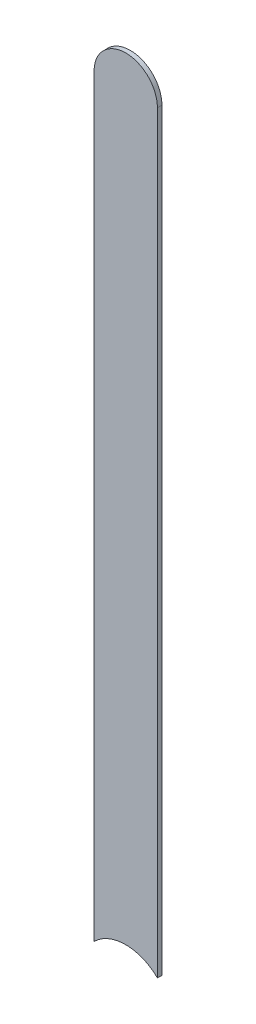
ISO-10303-21;
HEADER;
FILE_DESCRIPTION(('STEP AP214'),'2;1');
FILE_NAME('part.step','',(''),(''),'','','');
FILE_SCHEMA(('AUTOMOTIVE_DESIGN { 1 0 10303 214 1 1 1 1 }'));
ENDSEC;
DATA;
#1=APPLICATION_CONTEXT('core data for automotive mechanical design processes');
#2=APPLICATION_PROTOCOL_DEFINITION('international standard','automotive_design',2000,#1);
#3=PRODUCT_CONTEXT('',#1,'mechanical');
#4=PRODUCT('Part','Part','',(#3));
#5=PRODUCT_RELATED_PRODUCT_CATEGORY('part','',(#4));
#6=PRODUCT_DEFINITION_FORMATION('','',#4);
#7=PRODUCT_DEFINITION_CONTEXT('part definition',#1,'design');
#8=PRODUCT_DEFINITION('design','',#6,#7);
#9=PRODUCT_DEFINITION_SHAPE('','',#8);
#10=(LENGTH_UNIT() NAMED_UNIT(*) SI_UNIT(.MILLI.,.METRE.));
#11=(NAMED_UNIT(*) PLANE_ANGLE_UNIT() SI_UNIT($,.RADIAN.));
#12=(NAMED_UNIT(*) SI_UNIT($,.STERADIAN.) SOLID_ANGLE_UNIT());
#13=UNCERTAINTY_MEASURE_WITH_UNIT(LENGTH_MEASURE(1.E-05),#10,'distance_accuracy_value','');
#14=(GEOMETRIC_REPRESENTATION_CONTEXT(3) GLOBAL_UNCERTAINTY_ASSIGNED_CONTEXT((#13)) GLOBAL_UNIT_ASSIGNED_CONTEXT((#10,
#11,#12)) REPRESENTATION_CONTEXT('',''));
#15=CARTESIAN_POINT('',(0.,0.,0.));
#16=DIRECTION('',(0.,0.,1.));
#17=DIRECTION('',(1.,0.,0.));
#18=AXIS2_PLACEMENT_3D('',#15,#16,#17);
#19=CARTESIAN_POINT('',(48.15000022,65.7528876355931,0.));
#20=DIRECTION('',(-1.,0.,0.));
#21=DIRECTION('',(0.,1.,0.));
#22=AXIS2_PLACEMENT_3D('',#19,#20,#21);
#23=PLANE('',#22);
#24=DIRECTION('',(0.,1.,0.));
#25=VECTOR('',#24,1.);
#26=CARTESIAN_POINT('',(48.15000022,65.50000108,0.03556));
#27=LINE('',#26,#25);
#28=CARTESIAN_POINT('',(48.15000022,65.7528876355931,0.03556));
#29=VERTEX_POINT('',#28);
#30=CARTESIAN_POINT('',(48.15000022,71.70001408,0.03556));
#31=VERTEX_POINT('',#30);
#32=EDGE_CURVE('E11',#29,#31,#27,.T.);
#33=ORIENTED_EDGE('',*,*,#32,.F.);
#34=DIRECTION('',(0.,0.,1.));
#35=VECTOR('',#34,1.);
#36=CARTESIAN_POINT('',(48.15000022,65.7528876355931,0.));
#37=LINE('',#36,#35);
#38=CARTESIAN_POINT('',(48.15000022,65.7528876355931,0.));
#39=VERTEX_POINT('',#38);
#40=EDGE_CURVE('E24',#39,#29,#37,.T.);
#41=ORIENTED_EDGE('',*,*,#40,.F.);
#42=DIRECTION('',(0.,1.,0.));
#43=VECTOR('',#42,1.);
#44=CARTESIAN_POINT('',(48.15000022,65.50000108,0.));
#45=LINE('',#44,#43);
#46=CARTESIAN_POINT('',(48.15000022,71.70001408,0.));
#47=VERTEX_POINT('',#46);
#48=EDGE_CURVE('E75',#39,#47,#45,.T.);
#49=ORIENTED_EDGE('',*,*,#48,.T.);
#50=DIRECTION('',(0.,0.,1.));
#51=VECTOR('',#50,1.);
#52=CARTESIAN_POINT('',(48.15000022,71.70001408,0.));
#53=LINE('',#52,#51);
#54=EDGE_CURVE('E37',#47,#31,#53,.T.);
#55=ORIENTED_EDGE('',*,*,#54,.T.);
#56=EDGE_LOOP('',(#33,#41,#49,#55));
#57=FACE_BOUND('',#56,.T.);
#58=ADVANCED_FACE('F17',(#57),#23,.F.);
#59=CARTESIAN_POINT('',(47.90000072,71.70001408,0.));
#60=DIRECTION('',(0.,0.,-1.));
#61=DIRECTION('',(1.,0.,0.));
#62=AXIS2_PLACEMENT_3D('',#59,#60,#61);
#63=CYLINDRICAL_SURFACE('',#62,0.249999499999999);
#64=CARTESIAN_POINT('',(47.90000072,71.70001408,0.03556));
#65=DIRECTION('',(0.,0.,1.));
#66=DIRECTION('',(1.,0.,0.));
#67=AXIS2_PLACEMENT_3D('',#64,#65,#66);
#68=CIRCLE('',#67,0.249999499999999);
#69=CARTESIAN_POINT('',(47.65000122,71.70001408,0.03556));
#70=VERTEX_POINT('',#69);
#71=EDGE_CURVE('E83',#31,#70,#68,.T.);
#72=ORIENTED_EDGE('',*,*,#71,.F.);
#73=ORIENTED_EDGE('',*,*,#54,.F.);
#74=CARTESIAN_POINT('',(47.90000072,71.70001408,0.));
#75=DIRECTION('',(0.,0.,1.));
#76=DIRECTION('',(1.,0.,0.));
#77=AXIS2_PLACEMENT_3D('',#74,#75,#76);
#78=CIRCLE('',#77,0.249999499999999);
#79=CARTESIAN_POINT('',(47.65000122,71.70001408,0.));
#80=VERTEX_POINT('',#79);
#81=EDGE_CURVE('E81',#47,#80,#78,.T.);
#82=ORIENTED_EDGE('',*,*,#81,.T.);
#83=DIRECTION('',(0.,0.,1.));
#84=VECTOR('',#83,1.);
#85=CARTESIAN_POINT('',(47.65000122,71.70001408,0.));
#86=LINE('',#85,#84);
#87=EDGE_CURVE('E67',#80,#70,#86,.T.);
#88=ORIENTED_EDGE('',*,*,#87,.T.);
#89=EDGE_LOOP('',(#72,#73,#82,#88));
#90=FACE_BOUND('',#89,.T.);
#91=ADVANCED_FACE('F89',(#90),#63,.T.);
#92=CARTESIAN_POINT('',(47.65000122,71.70001408,0.));
#93=DIRECTION('',(1.,0.,0.));
#94=DIRECTION('',(0.,-1.,0.));
#95=AXIS2_PLACEMENT_3D('',#92,#93,#94);
#96=PLANE('',#95);
#97=DIRECTION('',(0.,-1.,0.));
#98=VECTOR('',#97,1.);
#99=CARTESIAN_POINT('',(47.65000122,71.70001408,0.03556));
#100=LINE('',#99,#98);
#101=CARTESIAN_POINT('',(47.65000122,65.7528876355931,0.03556));
#102=VERTEX_POINT('',#101);
#103=EDGE_CURVE('E71',#70,#102,#100,.T.);
#104=ORIENTED_EDGE('',*,*,#103,.F.);
#105=ORIENTED_EDGE('',*,*,#87,.F.);
#106=DIRECTION('',(0.,-1.,0.));
#107=VECTOR('',#106,1.);
#108=CARTESIAN_POINT('',(47.65000122,71.70001408,0.));
#109=LINE('',#108,#107);
#110=CARTESIAN_POINT('',(47.65000122,65.7528876355931,0.));
#111=VERTEX_POINT('',#110);
#112=EDGE_CURVE('E63',#80,#111,#109,.T.);
#113=ORIENTED_EDGE('',*,*,#112,.T.);
#114=DIRECTION('',(0.,0.,1.));
#115=VECTOR('',#114,1.);
#116=CARTESIAN_POINT('',(47.65000122,65.7528876355931,0.));
#117=LINE('',#116,#115);
#118=EDGE_CURVE('E53',#111,#102,#117,.T.);
#119=ORIENTED_EDGE('',*,*,#118,.T.);
#120=EDGE_LOOP('',(#104,#105,#113,#119));
#121=FACE_BOUND('',#120,.T.);
#122=ADVANCED_FACE('F66',(#121),#96,.F.);
#123=CARTESIAN_POINT('',(47.90000072,65.50000108,0.));
#124=DIRECTION('',(0.,0.,-1.));
#125=DIRECTION('',(1.,0.,0.));
#126=AXIS2_PLACEMENT_3D('',#123,#124,#125);
#127=CYLINDRICAL_SURFACE('',#126,0.3556);
#128=ORIENTED_EDGE('',*,*,#40,.T.);
#129=CARTESIAN_POINT('',(47.90000072,65.50000108,0.03556));
#130=DIRECTION('',(0.,0.,1.));
#131=DIRECTION('',(1.,0.,0.));
#132=AXIS2_PLACEMENT_3D('',#129,#130,#131);
#133=CIRCLE('',#132,0.3556);
#134=EDGE_CURVE('E59',#29,#102,#133,.T.);
#135=ORIENTED_EDGE('',*,*,#134,.T.);
#136=ORIENTED_EDGE('',*,*,#118,.F.);
#137=CARTESIAN_POINT('',(47.90000072,65.50000108,0.));
#138=DIRECTION('',(0.,0.,1.));
#139=DIRECTION('',(1.,0.,0.));
#140=AXIS2_PLACEMENT_3D('',#137,#138,#139);
#141=CIRCLE('',#140,0.3556);
#142=EDGE_CURVE('E57',#39,#111,#141,.T.);
#143=ORIENTED_EDGE('',*,*,#142,.F.);
#144=EDGE_LOOP('',(#128,#135,#136,#143));
#145=FACE_BOUND('',#144,.T.);
#146=ADVANCED_FACE('F55',(#145),#127,.F.);
#147=CARTESIAN_POINT('',(48.15000022,65.50000108,0.));
#148=DIRECTION('',(0.,0.,-1.));
#149=DIRECTION('',(-1.,0.,0.));
#150=AXIS2_PLACEMENT_3D('',#147,#148,#149);
#151=PLANE('',#150);
#152=ORIENTED_EDGE('',*,*,#48,.F.);
#153=ORIENTED_EDGE('',*,*,#142,.T.);
#154=ORIENTED_EDGE('',*,*,#112,.F.);
#155=ORIENTED_EDGE('',*,*,#81,.F.);
#156=EDGE_LOOP('',(#152,#153,#154,#155));
#157=FACE_BOUND('',#156,.T.);
#158=ADVANCED_FACE('F74',(#157),#151,.T.);
#159=CARTESIAN_POINT('',(48.15000022,65.50000108,0.03556));
#160=DIRECTION('',(0.,0.,-1.));
#161=DIRECTION('',(-1.,0.,0.));
#162=AXIS2_PLACEMENT_3D('',#159,#160,#161);
#163=PLANE('',#162);
#164=ORIENTED_EDGE('',*,*,#134,.F.);
#165=ORIENTED_EDGE('',*,*,#32,.T.);
#166=ORIENTED_EDGE('',*,*,#71,.T.);
#167=ORIENTED_EDGE('',*,*,#103,.T.);
#168=EDGE_LOOP('',(#164,#165,#166,#167));
#169=FACE_BOUND('',#168,.T.);
#170=ADVANCED_FACE('F91',(#169),#163,.F.);
#171=CLOSED_SHELL('',(#58,#91,#122,#146,#158,#170));
#172=MANIFOLD_SOLID_BREP('B1',#171);
#173=ADVANCED_BREP_SHAPE_REPRESENTATION('',(#18,#172),#14);
#174=SHAPE_DEFINITION_REPRESENTATION(#9,#173);
ENDSEC;
END-ISO-10303-21;
